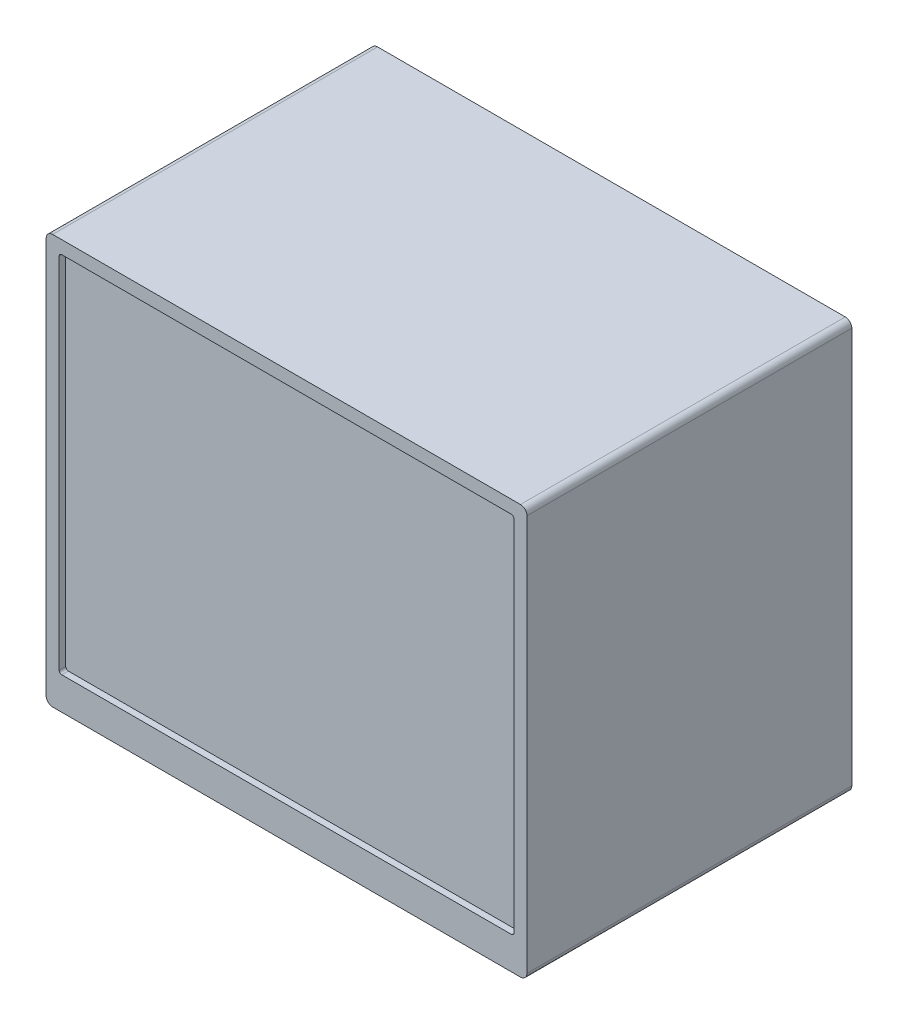
ISO-10303-21;
HEADER;
FILE_DESCRIPTION(('STEP AP214'),'2;1');
FILE_NAME('part.step','',(''),(''),'','','');
FILE_SCHEMA(('AUTOMOTIVE_DESIGN { 1 0 10303 214 1 1 1 1 }'));
ENDSEC;
DATA;
#1=APPLICATION_CONTEXT('core data for automotive mechanical design processes');
#2=APPLICATION_PROTOCOL_DEFINITION('international standard','automotive_design',2000,#1);
#3=PRODUCT_CONTEXT('',#1,'mechanical');
#4=PRODUCT('Part','Part','',(#3));
#5=PRODUCT_RELATED_PRODUCT_CATEGORY('part','',(#4));
#6=PRODUCT_DEFINITION_FORMATION('','',#4);
#7=PRODUCT_DEFINITION_CONTEXT('part definition',#1,'design');
#8=PRODUCT_DEFINITION('design','',#6,#7);
#9=PRODUCT_DEFINITION_SHAPE('','',#8);
#10=(LENGTH_UNIT() NAMED_UNIT(*) SI_UNIT(.MILLI.,.METRE.));
#11=(NAMED_UNIT(*) PLANE_ANGLE_UNIT() SI_UNIT($,.RADIAN.));
#12=(NAMED_UNIT(*) SI_UNIT($,.STERADIAN.) SOLID_ANGLE_UNIT());
#13=UNCERTAINTY_MEASURE_WITH_UNIT(LENGTH_MEASURE(1.E-05),#10,'distance_accuracy_value','');
#14=(GEOMETRIC_REPRESENTATION_CONTEXT(3) GLOBAL_UNCERTAINTY_ASSIGNED_CONTEXT((#13)) GLOBAL_UNIT_ASSIGNED_CONTEXT((#10,
#11,#12)) REPRESENTATION_CONTEXT('',''));
#15=CARTESIAN_POINT('',(0.,0.,0.));
#16=DIRECTION('',(0.,0.,1.));
#17=DIRECTION('',(1.,0.,0.));
#18=AXIS2_PLACEMENT_3D('',#15,#16,#17);
#19=CARTESIAN_POINT('',(-47.6192018015364,4.39835820913419,161.033070152966));
#20=DIRECTION('',(1.,0.,0.));
#21=DIRECTION('',(0.,0.,-1.));
#22=AXIS2_PLACEMENT_3D('',#19,#20,#21);
#23=PLANE('',#22);
#24=DIRECTION('',(0.,-1.,0.));
#25=VECTOR('',#24,1.);
#26=CARTESIAN_POINT('',(-47.6192018015364,4.39835820913419,86.0330701529656));
#27=LINE('',#26,#25);
#28=CARTESIAN_POINT('',(-47.6192018015364,2.89835820913418,86.0330701529656));
#29=VERTEX_POINT('',#28);
#30=CARTESIAN_POINT('',(-47.6192018015364,-88.6016417908658,86.0330701529656));
#31=VERTEX_POINT('',#30);
#32=EDGE_CURVE('E179',#29,#31,#27,.T.);
#33=ORIENTED_EDGE('',*,*,#32,.T.);
#34=DIRECTION('',(0.,0.,-1.));
#35=VECTOR('',#34,1.);
#36=CARTESIAN_POINT('',(-47.6192018015364,-88.6016417908658,161.033070152966));
#37=LINE('',#36,#35);
#38=CARTESIAN_POINT('',(-47.6192018015364,-88.6016417908658,161.033070152966));
#39=VERTEX_POINT('',#38);
#40=EDGE_CURVE('E208',#31,#39,#37,.F.);
#41=ORIENTED_EDGE('',*,*,#40,.T.);
#42=DIRECTION('',(0.,-1.,0.));
#43=VECTOR('',#42,1.);
#44=CARTESIAN_POINT('',(-47.6192018015364,4.39835820913419,161.033070152966));
#45=LINE('',#44,#43);
#46=CARTESIAN_POINT('',(-47.6192018015364,2.89835820913418,161.033070152966));
#47=VERTEX_POINT('',#46);
#48=EDGE_CURVE('E177',#47,#39,#45,.T.);
#49=ORIENTED_EDGE('',*,*,#48,.F.);
#50=DIRECTION('',(0.,0.,-1.));
#51=VECTOR('',#50,1.);
#52=CARTESIAN_POINT('',(-47.6192018015364,2.89835820913418,161.033070152966));
#53=LINE('',#52,#51);
#54=EDGE_CURVE('E205',#47,#29,#53,.T.);
#55=ORIENTED_EDGE('',*,*,#54,.T.);
#56=EDGE_LOOP('',(#33,#41,#49,#55));
#57=FACE_BOUND('',#56,.T.);
#58=ADVANCED_FACE('F35',(#57),#23,.F.);
#59=CARTESIAN_POINT('',(-47.6192018015364,-90.1016417908658,161.033070152966));
#60=DIRECTION('',(0.,1.,0.));
#61=DIRECTION('',(0.,0.,1.));
#62=AXIS2_PLACEMENT_3D('',#59,#60,#61);
#63=PLANE('',#62);
#64=DIRECTION('',(1.,0.,0.));
#65=VECTOR('',#64,1.);
#66=CARTESIAN_POINT('',(-47.6192018015364,-90.1016417908658,86.0330701529656));
#67=LINE('',#66,#65);
#68=CARTESIAN_POINT('',(-46.1192018015364,-90.1016417908658,86.0330701529656));
#69=VERTEX_POINT('',#68);
#70=CARTESIAN_POINT('',(61.8807981984636,-90.1016417908658,86.0330701529656));
#71=VERTEX_POINT('',#70);
#72=EDGE_CURVE('E174',#69,#71,#67,.T.);
#73=ORIENTED_EDGE('',*,*,#72,.T.);
#74=DIRECTION('',(0.,0.,-1.));
#75=VECTOR('',#74,1.);
#76=CARTESIAN_POINT('',(61.8807981984636,-90.1016417908658,161.033070152966));
#77=LINE('',#76,#75);
#78=CARTESIAN_POINT('',(61.8807981984636,-90.1016417908658,161.033070152966));
#79=VERTEX_POINT('',#78);
#80=EDGE_CURVE('E152',#71,#79,#77,.F.);
#81=ORIENTED_EDGE('',*,*,#80,.T.);
#82=DIRECTION('',(1.,0.,0.));
#83=VECTOR('',#82,1.);
#84=CARTESIAN_POINT('',(-47.6192018015364,-90.1016417908658,161.033070152966));
#85=LINE('',#84,#83);
#86=CARTESIAN_POINT('',(-46.1192018015364,-90.1016417908658,161.033070152966));
#87=VERTEX_POINT('',#86);
#88=EDGE_CURVE('E282',#87,#79,#85,.T.);
#89=ORIENTED_EDGE('',*,*,#88,.F.);
#90=DIRECTION('',(0.,0.,-1.));
#91=VECTOR('',#90,1.);
#92=CARTESIAN_POINT('',(-46.1192018015364,-90.1016417908658,161.033070152966));
#93=LINE('',#92,#91);
#94=EDGE_CURVE('E157',#87,#69,#93,.T.);
#95=ORIENTED_EDGE('',*,*,#94,.T.);
#96=EDGE_LOOP('',(#73,#81,#89,#95));
#97=FACE_BOUND('',#96,.T.);
#98=ADVANCED_FACE('F299',(#97),#63,.F.);
#99=CARTESIAN_POINT('',(63.3807981984636,4.39835820913419,161.033070152966));
#100=DIRECTION('',(-1.,0.,0.));
#101=DIRECTION('',(0.,-1.,0.));
#102=AXIS2_PLACEMENT_3D('',#99,#100,#101);
#103=PLANE('',#102);
#104=DIRECTION('',(0.,1.,0.));
#105=VECTOR('',#104,1.);
#106=CARTESIAN_POINT('',(63.3807981984636,4.39835820913419,161.033070152966));
#107=LINE('',#106,#105);
#108=CARTESIAN_POINT('',(63.3807981984637,-88.6016417908658,161.033070152966));
#109=VERTEX_POINT('',#108);
#110=CARTESIAN_POINT('',(63.3807981984636,2.89835820913418,161.033070152966));
#111=VERTEX_POINT('',#110);
#112=EDGE_CURVE('E167',#109,#111,#107,.T.);
#113=ORIENTED_EDGE('',*,*,#112,.F.);
#114=DIRECTION('',(0.,0.,-1.));
#115=VECTOR('',#114,1.);
#116=CARTESIAN_POINT('',(63.3807981984637,-88.6016417908658,161.033070152966));
#117=LINE('',#116,#115);
#118=CARTESIAN_POINT('',(63.3807981984637,-88.6016417908658,86.0330701529656));
#119=VERTEX_POINT('',#118);
#120=EDGE_CURVE('E151',#109,#119,#117,.T.);
#121=ORIENTED_EDGE('',*,*,#120,.T.);
#122=DIRECTION('',(0.,1.,0.));
#123=VECTOR('',#122,1.);
#124=CARTESIAN_POINT('',(63.3807981984636,4.39835820913419,86.0330701529656));
#125=LINE('',#124,#123);
#126=CARTESIAN_POINT('',(63.3807981984636,2.89835820913418,86.0330701529656));
#127=VERTEX_POINT('',#126);
#128=EDGE_CURVE('E164',#119,#127,#125,.T.);
#129=ORIENTED_EDGE('',*,*,#128,.T.);
#130=DIRECTION('',(0.,0.,-1.));
#131=VECTOR('',#130,1.);
#132=CARTESIAN_POINT('',(63.3807981984636,2.89835820913418,161.033070152966));
#133=LINE('',#132,#131);
#134=EDGE_CURVE('E169',#127,#111,#133,.F.);
#135=ORIENTED_EDGE('',*,*,#134,.T.);
#136=EDGE_LOOP('',(#113,#121,#129,#135));
#137=FACE_BOUND('',#136,.T.);
#138=ADVANCED_FACE('F163',(#137),#103,.F.);
#139=CARTESIAN_POINT('',(-47.6192018015364,4.39835820913419,161.033070152966));
#140=DIRECTION('',(0.,-1.,0.));
#141=DIRECTION('',(0.,0.,-1.));
#142=AXIS2_PLACEMENT_3D('',#139,#140,#141);
#143=PLANE('',#142);
#144=DIRECTION('',(-1.,0.,0.));
#145=VECTOR('',#144,1.);
#146=CARTESIAN_POINT('',(-47.6192018015364,4.39835820913419,161.033070152966));
#147=LINE('',#146,#145);
#148=CARTESIAN_POINT('',(61.8807981984636,4.39835820913419,161.033070152966));
#149=VERTEX_POINT('',#148);
#150=CARTESIAN_POINT('',(-46.1192018015364,4.39835820913419,161.033070152966));
#151=VERTEX_POINT('',#150);
#152=EDGE_CURVE('E183',#149,#151,#147,.T.);
#153=ORIENTED_EDGE('',*,*,#152,.F.);
#154=DIRECTION('',(0.,0.,-1.));
#155=VECTOR('',#154,1.);
#156=CARTESIAN_POINT('',(61.8807981984636,4.39835820913419,161.033070152966));
#157=LINE('',#156,#155);
#158=CARTESIAN_POINT('',(61.8807981984636,4.39835820913419,86.0330701529656));
#159=VERTEX_POINT('',#158);
#160=EDGE_CURVE('E202',#149,#159,#157,.T.);
#161=ORIENTED_EDGE('',*,*,#160,.T.);
#162=DIRECTION('',(-1.,0.,0.));
#163=VECTOR('',#162,1.);
#164=CARTESIAN_POINT('',(-47.6192018015364,4.39835820913419,86.0330701529656));
#165=LINE('',#164,#163);
#166=CARTESIAN_POINT('',(-46.1192018015364,4.39835820913419,86.0330701529656));
#167=VERTEX_POINT('',#166);
#168=EDGE_CURVE('E173',#159,#167,#165,.T.);
#169=ORIENTED_EDGE('',*,*,#168,.T.);
#170=DIRECTION('',(0.,0.,-1.));
#171=VECTOR('',#170,1.);
#172=CARTESIAN_POINT('',(-46.1192018015364,4.39835820913419,161.033070152966));
#173=LINE('',#172,#171);
#174=EDGE_CURVE('E200',#167,#151,#173,.F.);
#175=ORIENTED_EDGE('',*,*,#174,.T.);
#176=EDGE_LOOP('',(#153,#161,#169,#175));
#177=FACE_BOUND('',#176,.T.);
#178=ADVANCED_FACE('F306',(#177),#143,.F.);
#179=CARTESIAN_POINT('',(5.51655873892455,-30.0230928630414,161.033070152966));
#180=DIRECTION('',(0.,0.,1.));
#181=DIRECTION('',(1.,0.,0.));
#182=AXIS2_PLACEMENT_3D('',#179,#180,#181);
#183=PLANE('',#182);
#184=DIRECTION('',(0.,-1.,0.));
#185=VECTOR('',#184,1.);
#186=CARTESIAN_POINT('',(-44.6192018015364,1.39835820913419,161.033070152966));
#187=LINE('',#186,#185);
#188=CARTESIAN_POINT('',(-44.6192018015364,0.798358209134187,161.033070152966));
#189=VERTEX_POINT('',#188);
#190=CARTESIAN_POINT('',(-44.6192018015363,-82.0016417908658,161.033070152966));
#191=VERTEX_POINT('',#190);
#192=EDGE_CURVE('E245',#189,#191,#187,.T.);
#193=ORIENTED_EDGE('',*,*,#192,.F.);
#194=CARTESIAN_POINT('',(-44.0192018015364,0.798358209134187,161.033070152966));
#195=DIRECTION('',(0.,0.,1.));
#196=DIRECTION('',(1.,0.,0.));
#197=AXIS2_PLACEMENT_3D('',#194,#195,#196);
#198=CIRCLE('',#197,0.6);
#199=CARTESIAN_POINT('',(-44.0192018015364,1.39835820913419,161.033070152966));
#200=VERTEX_POINT('',#199);
#201=EDGE_CURVE('E43',#189,#200,#198,.F.);
#202=ORIENTED_EDGE('',*,*,#201,.T.);
#203=DIRECTION('',(-1.,0.,0.));
#204=VECTOR('',#203,1.);
#205=CARTESIAN_POINT('',(-44.6192018015364,1.39835820913419,161.033070152966));
#206=LINE('',#205,#204);
#207=CARTESIAN_POINT('',(59.7807981984636,1.39835820913419,161.033070152966));
#208=VERTEX_POINT('',#207);
#209=EDGE_CURVE('E244',#208,#200,#206,.T.);
#210=ORIENTED_EDGE('',*,*,#209,.F.);
#211=CARTESIAN_POINT('',(59.7807981984636,0.798358209134187,161.033070152966));
#212=DIRECTION('',(0.,0.,1.));
#213=DIRECTION('',(1.,0.,0.));
#214=AXIS2_PLACEMENT_3D('',#211,#212,#213);
#215=CIRCLE('',#214,0.6);
#216=CARTESIAN_POINT('',(60.3807981984636,0.798358209134187,161.033070152966));
#217=VERTEX_POINT('',#216);
#218=EDGE_CURVE('E239',#208,#217,#215,.F.);
#219=ORIENTED_EDGE('',*,*,#218,.T.);
#220=DIRECTION('',(0.,1.,0.));
#221=VECTOR('',#220,1.);
#222=CARTESIAN_POINT('',(60.3807981984636,1.39835820913419,161.033070152966));
#223=LINE('',#222,#221);
#224=CARTESIAN_POINT('',(60.3807981984637,-82.0016417908658,161.033070152966));
#225=VERTEX_POINT('',#224);
#226=EDGE_CURVE('E252',#225,#217,#223,.T.);
#227=ORIENTED_EDGE('',*,*,#226,.F.);
#228=CARTESIAN_POINT('',(59.7807981984637,-82.0016417908658,161.033070152966));
#229=DIRECTION('',(0.,0.,1.));
#230=DIRECTION('',(1.,0.,0.));
#231=AXIS2_PLACEMENT_3D('',#228,#229,#230);
#232=CIRCLE('',#231,0.6);
#233=CARTESIAN_POINT('',(59.7807981984637,-82.6016417908658,161.033070152966));
#234=VERTEX_POINT('',#233);
#235=EDGE_CURVE('E237',#225,#234,#232,.F.);
#236=ORIENTED_EDGE('',*,*,#235,.T.);
#237=DIRECTION('',(1.,0.,0.));
#238=VECTOR('',#237,1.);
#239=CARTESIAN_POINT('',(-44.6192018015363,-82.6016417908658,161.033070152966));
#240=LINE('',#239,#238);
#241=CARTESIAN_POINT('',(-44.0192018015363,-82.6016417908658,161.033070152966));
#242=VERTEX_POINT('',#241);
#243=EDGE_CURVE('E275',#242,#234,#240,.T.);
#244=ORIENTED_EDGE('',*,*,#243,.F.);
#245=CARTESIAN_POINT('',(-44.0192018015363,-82.0016417908658,161.033070152966));
#246=DIRECTION('',(0.,0.,1.));
#247=DIRECTION('',(1.,0.,0.));
#248=AXIS2_PLACEMENT_3D('',#245,#246,#247);
#249=CIRCLE('',#248,0.6);
#250=EDGE_CURVE('E11',#242,#191,#249,.F.);
#251=ORIENTED_EDGE('',*,*,#250,.T.);
#252=EDGE_LOOP('',(#193,#202,#210,#219,#227,#236,#244,#251));
#253=FACE_BOUND('',#252,.T.);
#254=ORIENTED_EDGE('',*,*,#88,.T.);
#255=CARTESIAN_POINT('',(61.8807981984636,-88.6016417908658,161.033070152966));
#256=DIRECTION('',(0.,0.,1.));
#257=DIRECTION('',(1.,0.,0.));
#258=AXIS2_PLACEMENT_3D('',#255,#256,#257);
#259=CIRCLE('',#258,1.5);
#260=EDGE_CURVE('E198',#79,#109,#259,.T.);
#261=ORIENTED_EDGE('',*,*,#260,.T.);
#262=ORIENTED_EDGE('',*,*,#112,.T.);
#263=CARTESIAN_POINT('',(61.8807981984636,2.89835820913418,161.033070152966));
#264=DIRECTION('',(0.,0.,1.));
#265=DIRECTION('',(1.,0.,0.));
#266=AXIS2_PLACEMENT_3D('',#263,#264,#265);
#267=CIRCLE('',#266,1.5);
#268=EDGE_CURVE('E196',#111,#149,#267,.T.);
#269=ORIENTED_EDGE('',*,*,#268,.T.);
#270=ORIENTED_EDGE('',*,*,#152,.T.);
#271=CARTESIAN_POINT('',(-46.1192018015364,2.89835820913418,161.033070152966));
#272=DIRECTION('',(0.,0.,1.));
#273=DIRECTION('',(1.,0.,0.));
#274=AXIS2_PLACEMENT_3D('',#271,#272,#273);
#275=CIRCLE('',#274,1.5);
#276=EDGE_CURVE('E192',#151,#47,#275,.T.);
#277=ORIENTED_EDGE('',*,*,#276,.T.);
#278=ORIENTED_EDGE('',*,*,#48,.T.);
#279=CARTESIAN_POINT('',(-46.1192018015364,-88.6016417908658,161.033070152966));
#280=DIRECTION('',(0.,0.,1.));
#281=DIRECTION('',(1.,0.,0.));
#282=AXIS2_PLACEMENT_3D('',#279,#280,#281);
#283=CIRCLE('',#282,1.5);
#284=EDGE_CURVE('E194',#39,#87,#283,.T.);
#285=ORIENTED_EDGE('',*,*,#284,.T.);
#286=EDGE_LOOP('',(#254,#261,#262,#269,#270,#277,#278,#285));
#287=FACE_BOUND('',#286,.T.);
#288=ADVANCED_FACE('F242',(#253,#287),#183,.T.);
#289=CARTESIAN_POINT('',(5.51655873892455,-30.0230928630414,86.0330701529656));
#290=DIRECTION('',(0.,0.,1.));
#291=DIRECTION('',(1.,0.,0.));
#292=AXIS2_PLACEMENT_3D('',#289,#290,#291);
#293=PLANE('',#292);
#294=ORIENTED_EDGE('',*,*,#128,.F.);
#295=CARTESIAN_POINT('',(61.8807981984636,-88.6016417908658,86.0330701529656));
#296=DIRECTION('',(0.,0.,1.));
#297=DIRECTION('',(1.,0.,0.));
#298=AXIS2_PLACEMENT_3D('',#295,#296,#297);
#299=CIRCLE('',#298,1.5);
#300=EDGE_CURVE('E147',#119,#71,#299,.F.);
#301=ORIENTED_EDGE('',*,*,#300,.T.);
#302=ORIENTED_EDGE('',*,*,#72,.F.);
#303=CARTESIAN_POINT('',(-46.1192018015364,-88.6016417908658,86.0330701529656));
#304=DIRECTION('',(0.,0.,1.));
#305=DIRECTION('',(1.,0.,0.));
#306=AXIS2_PLACEMENT_3D('',#303,#304,#305);
#307=CIRCLE('',#306,1.5);
#308=EDGE_CURVE('E186',#69,#31,#307,.F.);
#309=ORIENTED_EDGE('',*,*,#308,.T.);
#310=ORIENTED_EDGE('',*,*,#32,.F.);
#311=CARTESIAN_POINT('',(-46.1192018015364,2.89835820913418,86.0330701529656));
#312=DIRECTION('',(0.,0.,1.));
#313=DIRECTION('',(1.,0.,0.));
#314=AXIS2_PLACEMENT_3D('',#311,#312,#313);
#315=CIRCLE('',#314,1.5);
#316=EDGE_CURVE('E168',#29,#167,#315,.F.);
#317=ORIENTED_EDGE('',*,*,#316,.T.);
#318=ORIENTED_EDGE('',*,*,#168,.F.);
#319=CARTESIAN_POINT('',(61.8807981984636,2.89835820913418,86.0330701529656));
#320=DIRECTION('',(0.,0.,1.));
#321=DIRECTION('',(1.,0.,0.));
#322=AXIS2_PLACEMENT_3D('',#319,#320,#321);
#323=CIRCLE('',#322,1.5);
#324=EDGE_CURVE('E158',#159,#127,#323,.F.);
#325=ORIENTED_EDGE('',*,*,#324,.T.);
#326=EDGE_LOOP('',(#294,#301,#302,#309,#310,#317,#318,#325));
#327=FACE_BOUND('',#326,.T.);
#328=ADVANCED_FACE('F171',(#327),#293,.F.);
#329=CARTESIAN_POINT('',(61.8807981984636,-88.6016417908658,161.033070152966));
#330=DIRECTION('',(0.,0.,-1.));
#331=DIRECTION('',(-1.,0.,0.));
#332=AXIS2_PLACEMENT_3D('',#329,#330,#331);
#333=CYLINDRICAL_SURFACE('',#332,1.5);
#334=ORIENTED_EDGE('',*,*,#260,.F.);
#335=ORIENTED_EDGE('',*,*,#80,.F.);
#336=ORIENTED_EDGE('',*,*,#300,.F.);
#337=ORIENTED_EDGE('',*,*,#120,.F.);
#338=EDGE_LOOP('',(#334,#335,#336,#337));
#339=FACE_BOUND('',#338,.T.);
#340=ADVANCED_FACE('F150',(#339),#333,.T.);
#341=CARTESIAN_POINT('',(61.8807981984636,2.89835820913418,161.033070152966));
#342=DIRECTION('',(0.,0.,-1.));
#343=DIRECTION('',(-1.,0.,0.));
#344=AXIS2_PLACEMENT_3D('',#341,#342,#343);
#345=CYLINDRICAL_SURFACE('',#344,1.5);
#346=ORIENTED_EDGE('',*,*,#268,.F.);
#347=ORIENTED_EDGE('',*,*,#134,.F.);
#348=ORIENTED_EDGE('',*,*,#324,.F.);
#349=ORIENTED_EDGE('',*,*,#160,.F.);
#350=EDGE_LOOP('',(#346,#347,#348,#349));
#351=FACE_BOUND('',#350,.T.);
#352=ADVANCED_FACE('F313',(#351),#345,.T.);
#353=CARTESIAN_POINT('',(-46.1192018015364,-88.6016417908658,161.033070152966));
#354=DIRECTION('',(0.,0.,-1.));
#355=DIRECTION('',(-1.,0.,0.));
#356=AXIS2_PLACEMENT_3D('',#353,#354,#355);
#357=CYLINDRICAL_SURFACE('',#356,1.5);
#358=ORIENTED_EDGE('',*,*,#284,.F.);
#359=ORIENTED_EDGE('',*,*,#40,.F.);
#360=ORIENTED_EDGE('',*,*,#308,.F.);
#361=ORIENTED_EDGE('',*,*,#94,.F.);
#362=EDGE_LOOP('',(#358,#359,#360,#361));
#363=FACE_BOUND('',#362,.T.);
#364=ADVANCED_FACE('F295',(#363),#357,.T.);
#365=CARTESIAN_POINT('',(-46.1192018015364,2.89835820913418,161.033070152966));
#366=DIRECTION('',(0.,0.,-1.));
#367=DIRECTION('',(-1.,0.,0.));
#368=AXIS2_PLACEMENT_3D('',#365,#366,#367);
#369=CYLINDRICAL_SURFACE('',#368,1.5);
#370=ORIENTED_EDGE('',*,*,#276,.F.);
#371=ORIENTED_EDGE('',*,*,#174,.F.);
#372=ORIENTED_EDGE('',*,*,#316,.F.);
#373=ORIENTED_EDGE('',*,*,#54,.F.);
#374=EDGE_LOOP('',(#370,#371,#372,#373));
#375=FACE_BOUND('',#374,.T.);
#376=ADVANCED_FACE('F319',(#375),#369,.T.);
#377=CARTESIAN_POINT('',(-44.6192018015364,1.39835820913419,159.533070152966));
#378=DIRECTION('',(-1.,0.,0.));
#379=DIRECTION('',(0.,-1.,0.));
#380=AXIS2_PLACEMENT_3D('',#377,#378,#379);
#381=PLANE('',#380);
#382=DIRECTION('',(0.,-1.,0.));
#383=VECTOR('',#382,1.);
#384=CARTESIAN_POINT('',(-44.6192018015364,1.39835820913419,159.533070152966));
#385=LINE('',#384,#383);
#386=CARTESIAN_POINT('',(-44.6192018015364,0.798358209134187,159.533070152966));
#387=VERTEX_POINT('',#386);
#388=CARTESIAN_POINT('',(-44.6192018015363,-82.0016417908658,159.533070152966));
#389=VERTEX_POINT('',#388);
#390=EDGE_CURVE('E251',#387,#389,#385,.T.);
#391=ORIENTED_EDGE('',*,*,#390,.F.);
#392=DIRECTION('',(0.,0.,1.));
#393=VECTOR('',#392,1.);
#394=CARTESIAN_POINT('',(-44.6192018015364,0.798358209134187,161.033070152966));
#395=LINE('',#394,#393);
#396=EDGE_CURVE('E235',#387,#189,#395,.T.);
#397=ORIENTED_EDGE('',*,*,#396,.T.);
#398=ORIENTED_EDGE('',*,*,#192,.T.);
#399=DIRECTION('',(0.,0.,1.));
#400=VECTOR('',#399,1.);
#401=CARTESIAN_POINT('',(-44.6192018015363,-82.0016417908658,159.533070152966));
#402=LINE('',#401,#400);
#403=EDGE_CURVE('E233',#191,#389,#402,.F.);
#404=ORIENTED_EDGE('',*,*,#403,.T.);
#405=EDGE_LOOP('',(#391,#397,#398,#404));
#406=FACE_BOUND('',#405,.T.);
#407=ADVANCED_FACE('F264',(#406),#381,.F.);
#408=CARTESIAN_POINT('',(-44.6192018015364,1.39835820913419,159.533070152966));
#409=DIRECTION('',(0.,1.,0.));
#410=DIRECTION('',(0.,0.,1.));
#411=AXIS2_PLACEMENT_3D('',#408,#409,#410);
#412=PLANE('',#411);
#413=DIRECTION('',(-1.,0.,0.));
#414=VECTOR('',#413,1.);
#415=CARTESIAN_POINT('',(-44.6192018015364,1.39835820913419,159.533070152966));
#416=LINE('',#415,#414);
#417=CARTESIAN_POINT('',(59.7807981984636,1.39835820913419,159.533070152966));
#418=VERTEX_POINT('',#417);
#419=CARTESIAN_POINT('',(-44.0192018015364,1.39835820913419,159.533070152966));
#420=VERTEX_POINT('',#419);
#421=EDGE_CURVE('E262',#418,#420,#416,.T.);
#422=ORIENTED_EDGE('',*,*,#421,.F.);
#423=DIRECTION('',(0.,0.,1.));
#424=VECTOR('',#423,1.);
#425=CARTESIAN_POINT('',(59.7807981984636,1.39835820913419,161.033070152966));
#426=LINE('',#425,#424);
#427=EDGE_CURVE('E230',#418,#208,#426,.T.);
#428=ORIENTED_EDGE('',*,*,#427,.T.);
#429=ORIENTED_EDGE('',*,*,#209,.T.);
#430=DIRECTION('',(0.,0.,1.));
#431=VECTOR('',#430,1.);
#432=CARTESIAN_POINT('',(-44.0192018015364,1.39835820913419,159.533070152966));
#433=LINE('',#432,#431);
#434=EDGE_CURVE('E228',#200,#420,#433,.F.);
#435=ORIENTED_EDGE('',*,*,#434,.T.);
#436=EDGE_LOOP('',(#422,#428,#429,#435));
#437=FACE_BOUND('',#436,.T.);
#438=ADVANCED_FACE('F248',(#437),#412,.F.);
#439=CARTESIAN_POINT('',(60.3807981984636,1.39835820913419,159.533070152966));
#440=DIRECTION('',(1.,0.,0.));
#441=DIRECTION('',(0.,1.,0.));
#442=AXIS2_PLACEMENT_3D('',#439,#440,#441);
#443=PLANE('',#442);
#444=DIRECTION('',(0.,1.,0.));
#445=VECTOR('',#444,1.);
#446=CARTESIAN_POINT('',(60.3807981984636,1.39835820913419,159.533070152966));
#447=LINE('',#446,#445);
#448=CARTESIAN_POINT('',(60.3807981984637,-82.0016417908658,159.533070152966));
#449=VERTEX_POINT('',#448);
#450=CARTESIAN_POINT('',(60.3807981984636,0.798358209134187,159.533070152966));
#451=VERTEX_POINT('',#450);
#452=EDGE_CURVE('E268',#449,#451,#447,.T.);
#453=ORIENTED_EDGE('',*,*,#452,.F.);
#454=DIRECTION('',(0.,0.,1.));
#455=VECTOR('',#454,1.);
#456=CARTESIAN_POINT('',(60.3807981984637,-82.0016417908658,161.033070152966));
#457=LINE('',#456,#455);
#458=EDGE_CURVE('E212',#449,#225,#457,.T.);
#459=ORIENTED_EDGE('',*,*,#458,.T.);
#460=ORIENTED_EDGE('',*,*,#226,.T.);
#461=DIRECTION('',(0.,0.,1.));
#462=VECTOR('',#461,1.);
#463=CARTESIAN_POINT('',(60.3807981984636,0.798358209134187,159.533070152966));
#464=LINE('',#463,#462);
#465=EDGE_CURVE('E210',#217,#451,#464,.F.);
#466=ORIENTED_EDGE('',*,*,#465,.T.);
#467=EDGE_LOOP('',(#453,#459,#460,#466));
#468=FACE_BOUND('',#467,.T.);
#469=ADVANCED_FACE('F347',(#468),#443,.F.);
#470=CARTESIAN_POINT('',(-44.6192018015363,-82.6016417908658,159.533070152966));
#471=DIRECTION('',(0.,-1.,0.));
#472=DIRECTION('',(0.,0.,-1.));
#473=AXIS2_PLACEMENT_3D('',#470,#471,#472);
#474=PLANE('',#473);
#475=ORIENTED_EDGE('',*,*,#243,.T.);
#476=DIRECTION('',(0.,0.,1.));
#477=VECTOR('',#476,1.);
#478=CARTESIAN_POINT('',(59.7807981984637,-82.6016417908658,159.533070152966));
#479=LINE('',#478,#477);
#480=CARTESIAN_POINT('',(59.7807981984637,-82.6016417908658,159.533070152966));
#481=VERTEX_POINT('',#480);
#482=EDGE_CURVE('E218',#234,#481,#479,.F.);
#483=ORIENTED_EDGE('',*,*,#482,.T.);
#484=DIRECTION('',(1.,0.,0.));
#485=VECTOR('',#484,1.);
#486=CARTESIAN_POINT('',(-44.6192018015363,-82.6016417908658,159.533070152966));
#487=LINE('',#486,#485);
#488=CARTESIAN_POINT('',(-44.0192018015363,-82.6016417908658,159.533070152966));
#489=VERTEX_POINT('',#488);
#490=EDGE_CURVE('E266',#489,#481,#487,.T.);
#491=ORIENTED_EDGE('',*,*,#490,.F.);
#492=DIRECTION('',(0.,0.,1.));
#493=VECTOR('',#492,1.);
#494=CARTESIAN_POINT('',(-44.0192018015363,-82.6016417908658,161.033070152966));
#495=LINE('',#494,#493);
#496=EDGE_CURVE('E215',#489,#242,#495,.T.);
#497=ORIENTED_EDGE('',*,*,#496,.T.);
#498=EDGE_LOOP('',(#475,#483,#491,#497));
#499=FACE_BOUND('',#498,.T.);
#500=ADVANCED_FACE('F341',(#499),#474,.F.);
#501=CARTESIAN_POINT('',(5.51655873892455,-30.0230928630414,159.533070152966));
#502=DIRECTION('',(0.,0.,1.));
#503=DIRECTION('',(1.,0.,0.));
#504=AXIS2_PLACEMENT_3D('',#501,#502,#503);
#505=PLANE('',#504);
#506=ORIENTED_EDGE('',*,*,#490,.T.);
#507=CARTESIAN_POINT('',(59.7807981984637,-82.0016417908658,159.533070152966));
#508=DIRECTION('',(0.,0.,1.));
#509=DIRECTION('',(1.,0.,0.));
#510=AXIS2_PLACEMENT_3D('',#507,#508,#509);
#511=CIRCLE('',#510,0.6);
#512=EDGE_CURVE('E226',#481,#449,#511,.T.);
#513=ORIENTED_EDGE('',*,*,#512,.T.);
#514=ORIENTED_EDGE('',*,*,#452,.T.);
#515=CARTESIAN_POINT('',(59.7807981984636,0.798358209134187,159.533070152966));
#516=DIRECTION('',(0.,0.,1.));
#517=DIRECTION('',(1.,0.,0.));
#518=AXIS2_PLACEMENT_3D('',#515,#516,#517);
#519=CIRCLE('',#518,0.6);
#520=EDGE_CURVE('E224',#451,#418,#519,.T.);
#521=ORIENTED_EDGE('',*,*,#520,.T.);
#522=ORIENTED_EDGE('',*,*,#421,.T.);
#523=CARTESIAN_POINT('',(-44.0192018015364,0.798358209134187,159.533070152966));
#524=DIRECTION('',(0.,0.,1.));
#525=DIRECTION('',(1.,0.,0.));
#526=AXIS2_PLACEMENT_3D('',#523,#524,#525);
#527=CIRCLE('',#526,0.6);
#528=EDGE_CURVE('E222',#420,#387,#527,.T.);
#529=ORIENTED_EDGE('',*,*,#528,.T.);
#530=ORIENTED_EDGE('',*,*,#390,.T.);
#531=CARTESIAN_POINT('',(-44.0192018015363,-82.0016417908658,159.533070152966));
#532=DIRECTION('',(0.,0.,1.));
#533=DIRECTION('',(1.,0.,0.));
#534=AXIS2_PLACEMENT_3D('',#531,#532,#533);
#535=CIRCLE('',#534,0.6);
#536=EDGE_CURVE('E220',#389,#489,#535,.T.);
#537=ORIENTED_EDGE('',*,*,#536,.T.);
#538=EDGE_LOOP('',(#506,#513,#514,#521,#522,#529,#530,#537));
#539=FACE_BOUND('',#538,.T.);
#540=ADVANCED_FACE('F260',(#539),#505,.T.);
#541=CARTESIAN_POINT('',(59.7807981984637,-82.0016417908658,159.533070152966));
#542=DIRECTION('',(0.,0.,-1.));
#543=DIRECTION('',(-1.,0.,0.));
#544=AXIS2_PLACEMENT_3D('',#541,#542,#543);
#545=CYLINDRICAL_SURFACE('',#544,0.6);
#546=ORIENTED_EDGE('',*,*,#512,.F.);
#547=ORIENTED_EDGE('',*,*,#482,.F.);
#548=ORIENTED_EDGE('',*,*,#235,.F.);
#549=ORIENTED_EDGE('',*,*,#458,.F.);
#550=EDGE_LOOP('',(#546,#547,#548,#549));
#551=FACE_BOUND('',#550,.T.);
#552=ADVANCED_FACE('F323',(#551),#545,.F.);
#553=CARTESIAN_POINT('',(59.7807981984636,0.798358209134187,159.533070152966));
#554=DIRECTION('',(0.,0.,-1.));
#555=DIRECTION('',(-1.,0.,0.));
#556=AXIS2_PLACEMENT_3D('',#553,#554,#555);
#557=CYLINDRICAL_SURFACE('',#556,0.6);
#558=ORIENTED_EDGE('',*,*,#520,.F.);
#559=ORIENTED_EDGE('',*,*,#465,.F.);
#560=ORIENTED_EDGE('',*,*,#218,.F.);
#561=ORIENTED_EDGE('',*,*,#427,.F.);
#562=EDGE_LOOP('',(#558,#559,#560,#561));
#563=FACE_BOUND('',#562,.T.);
#564=ADVANCED_FACE('F326',(#563),#557,.F.);
#565=CARTESIAN_POINT('',(-44.0192018015364,0.798358209134187,159.533070152966));
#566=DIRECTION('',(0.,0.,-1.));
#567=DIRECTION('',(-1.,0.,0.));
#568=AXIS2_PLACEMENT_3D('',#565,#566,#567);
#569=CYLINDRICAL_SURFACE('',#568,0.6);
#570=ORIENTED_EDGE('',*,*,#528,.F.);
#571=ORIENTED_EDGE('',*,*,#434,.F.);
#572=ORIENTED_EDGE('',*,*,#201,.F.);
#573=ORIENTED_EDGE('',*,*,#396,.F.);
#574=EDGE_LOOP('',(#570,#571,#572,#573));
#575=FACE_BOUND('',#574,.T.);
#576=ADVANCED_FACE('F255',(#575),#569,.F.);
#577=CARTESIAN_POINT('',(-44.0192018015363,-82.0016417908658,159.533070152966));
#578=DIRECTION('',(0.,0.,-1.));
#579=DIRECTION('',(-1.,0.,0.));
#580=AXIS2_PLACEMENT_3D('',#577,#578,#579);
#581=CYLINDRICAL_SURFACE('',#580,0.6);
#582=ORIENTED_EDGE('',*,*,#536,.F.);
#583=ORIENTED_EDGE('',*,*,#403,.F.);
#584=ORIENTED_EDGE('',*,*,#250,.F.);
#585=ORIENTED_EDGE('',*,*,#496,.F.);
#586=EDGE_LOOP('',(#582,#583,#584,#585));
#587=FACE_BOUND('',#586,.T.);
#588=ADVANCED_FACE('F37',(#587),#581,.F.);
#589=CLOSED_SHELL('',(#58,#98,#138,#178,#288,#328,#340,#352,#364,#376,#407,#438,#469,#500,#540,
#552,#564,#576,#588));
#590=MANIFOLD_SOLID_BREP('B2',#589);
#591=ADVANCED_BREP_SHAPE_REPRESENTATION('',(#18,#590),#14);
#592=SHAPE_DEFINITION_REPRESENTATION(#9,#591);
ENDSEC;
END-ISO-10303-21;
